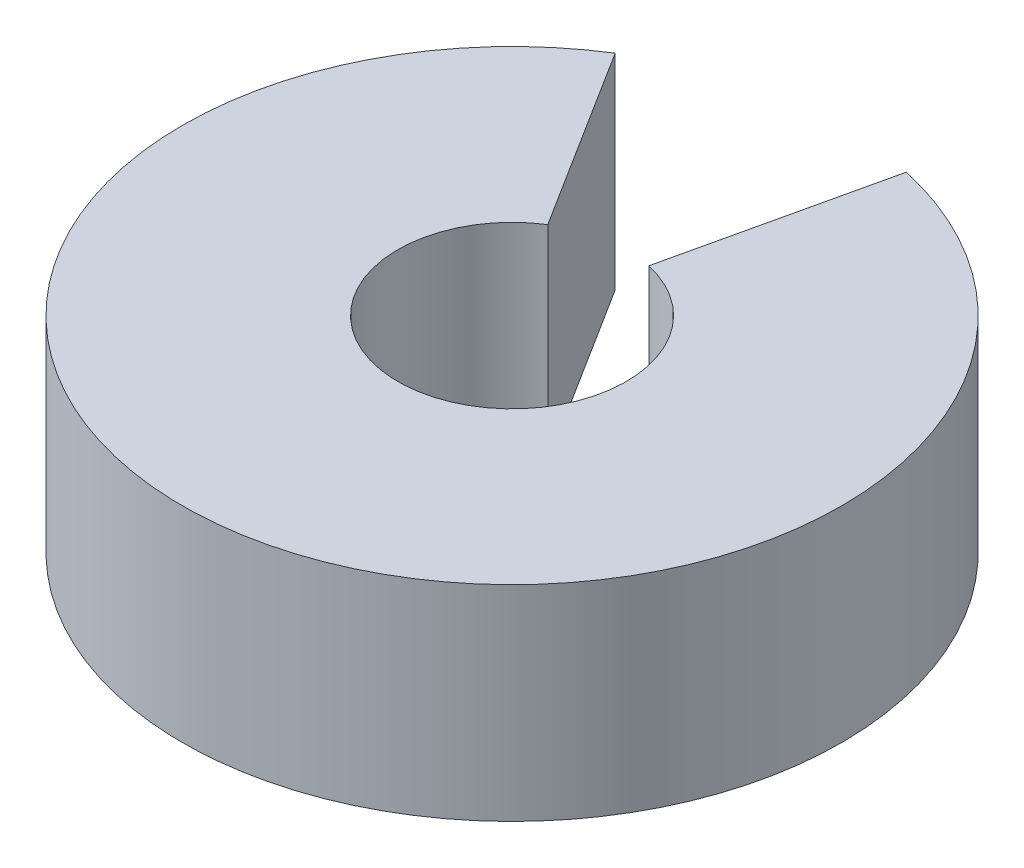
ISO-10303-21;
HEADER;
FILE_DESCRIPTION(('STEP AP214'),'2;1');
FILE_NAME('part.step','',(''),(''),'','','');
FILE_SCHEMA(('AUTOMOTIVE_DESIGN { 1 0 10303 214 1 1 1 1 }'));
ENDSEC;
DATA;
#1=APPLICATION_CONTEXT('core data for automotive mechanical design processes');
#2=APPLICATION_PROTOCOL_DEFINITION('international standard','automotive_design',2000,#1);
#3=PRODUCT_CONTEXT('',#1,'mechanical');
#4=PRODUCT('Part','Part','',(#3));
#5=PRODUCT_RELATED_PRODUCT_CATEGORY('part','',(#4));
#6=PRODUCT_DEFINITION_FORMATION('','',#4);
#7=PRODUCT_DEFINITION_CONTEXT('part definition',#1,'design');
#8=PRODUCT_DEFINITION('design','',#6,#7);
#9=PRODUCT_DEFINITION_SHAPE('','',#8);
#10=(LENGTH_UNIT() NAMED_UNIT(*) SI_UNIT(.MILLI.,.METRE.));
#11=(NAMED_UNIT(*) PLANE_ANGLE_UNIT() SI_UNIT($,.RADIAN.));
#12=(NAMED_UNIT(*) SI_UNIT($,.STERADIAN.) SOLID_ANGLE_UNIT());
#13=UNCERTAINTY_MEASURE_WITH_UNIT(LENGTH_MEASURE(1.E-05),#10,'distance_accuracy_value','');
#14=(GEOMETRIC_REPRESENTATION_CONTEXT(3) GLOBAL_UNCERTAINTY_ASSIGNED_CONTEXT((#13)) GLOBAL_UNIT_ASSIGNED_CONTEXT((#10,
#11,#12)) REPRESENTATION_CONTEXT('',''));
#15=CARTESIAN_POINT('',(0.,0.,0.));
#16=DIRECTION('',(0.,0.,1.));
#17=DIRECTION('',(1.,0.,0.));
#18=AXIS2_PLACEMENT_3D('',#15,#16,#17);
#19=CARTESIAN_POINT('',(0.,7.,0.));
#20=DIRECTION('',(0.,-1.,0.));
#21=DIRECTION('',(0.,0.,-1.));
#22=AXIS2_PLACEMENT_3D('',#19,#20,#21);
#23=CYLINDRICAL_SURFACE('',#22,11.25);
#24=DIRECTION('',(0.,1.,0.));
#25=VECTOR('',#24,1.);
#26=CARTESIAN_POINT('',(-5.99755002189294,0.,-9.51797739726734));
#27=LINE('',#26,#25);
#28=CARTESIAN_POINT('',(-5.99755002189294,0.,-9.51797739726734));
#29=VERTEX_POINT('',#28);
#30=CARTESIAN_POINT('',(-5.99755002189294,7.,-9.51797739726734));
#31=VERTEX_POINT('',#30);
#32=EDGE_CURVE('E110',#29,#31,#27,.T.);
#33=ORIENTED_EDGE('',*,*,#32,.F.);
#34=CARTESIAN_POINT('',(0.,0.,0.));
#35=DIRECTION('',(0.,1.,0.));
#36=DIRECTION('',(0.,0.,1.));
#37=AXIS2_PLACEMENT_3D('',#34,#35,#36);
#38=CIRCLE('',#37,11.25);
#39=CARTESIAN_POINT('',(2.48931806980201,0.,-10.971134651774));
#40=VERTEX_POINT('',#39);
#41=EDGE_CURVE('E48',#29,#40,#38,.T.);
#42=ORIENTED_EDGE('',*,*,#41,.T.);
#43=DIRECTION('',(0.,1.,0.));
#44=VECTOR('',#43,1.);
#45=CARTESIAN_POINT('',(2.48931806980201,0.,-10.971134651774));
#46=LINE('',#45,#44);
#47=CARTESIAN_POINT('',(2.48931806980201,7.,-10.971134651774));
#48=VERTEX_POINT('',#47);
#49=EDGE_CURVE('E115',#40,#48,#46,.T.);
#50=ORIENTED_EDGE('',*,*,#49,.T.);
#51=CARTESIAN_POINT('',(0.,7.,0.));
#52=DIRECTION('',(0.,1.,0.));
#53=DIRECTION('',(0.,0.,1.));
#54=AXIS2_PLACEMENT_3D('',#51,#52,#53);
#55=CIRCLE('',#54,11.25);
#56=EDGE_CURVE('E11',#31,#48,#55,.T.);
#57=ORIENTED_EDGE('',*,*,#56,.F.);
#58=EDGE_LOOP('',(#33,#42,#50,#57));
#59=FACE_BOUND('',#58,.T.);
#60=ADVANCED_FACE('F45',(#59),#23,.T.);
#61=CARTESIAN_POINT('',(0.,7.,0.));
#62=DIRECTION('',(0.,1.,0.));
#63=DIRECTION('',(0.,0.,1.));
#64=AXIS2_PLACEMENT_3D('',#61,#62,#63);
#65=PLANE('',#64);
#66=CARTESIAN_POINT('',(0.,7.,0.));
#67=DIRECTION('',(0.,1.,0.));
#68=DIRECTION('',(0.,0.,1.));
#69=AXIS2_PLACEMENT_3D('',#66,#67,#68);
#70=CIRCLE('',#69,3.9);
#71=CARTESIAN_POINT('',(-2.07915067425622,7.,-3.29956549771934));
#72=VERTEX_POINT('',#71);
#73=CARTESIAN_POINT('',(0.862963597531363,7.,-3.80332667928167));
#74=VERTEX_POINT('',#73);
#75=EDGE_CURVE('E106',#72,#74,#70,.T.);
#76=ORIENTED_EDGE('',*,*,#75,.F.);
#77=DIRECTION('',(-0.533115557501595,0.,-0.846042435312652));
#78=VECTOR('',#77,1.);
#79=CARTESIAN_POINT('',(0.,7.,0.));
#80=LINE('',#79,#78);
#81=EDGE_CURVE('E60',#72,#31,#80,.T.);
#82=ORIENTED_EDGE('',*,*,#81,.T.);
#83=ORIENTED_EDGE('',*,*,#56,.T.);
#84=DIRECTION('',(0.221272717315734,0.,-0.975211969046582));
#85=VECTOR('',#84,1.);
#86=CARTESIAN_POINT('',(0.,7.,0.));
#87=LINE('',#86,#85);
#88=EDGE_CURVE('E102',#74,#48,#87,.T.);
#89=ORIENTED_EDGE('',*,*,#88,.F.);
#90=EDGE_LOOP('',(#76,#82,#83,#89));
#91=FACE_BOUND('',#90,.T.);
#92=ADVANCED_FACE('F129',(#91),#65,.T.);
#93=CARTESIAN_POINT('',(0.,0.,0.));
#94=DIRECTION('',(0.,1.,0.));
#95=DIRECTION('',(0.,0.,1.));
#96=AXIS2_PLACEMENT_3D('',#93,#94,#95);
#97=PLANE('',#96);
#98=DIRECTION('',(-0.533115557501595,0.,-0.846042435312652));
#99=VECTOR('',#98,1.);
#100=CARTESIAN_POINT('',(0.,0.,0.));
#101=LINE('',#100,#99);
#102=CARTESIAN_POINT('',(-2.07915067425622,0.,-3.29956549771934));
#103=VERTEX_POINT('',#102);
#104=EDGE_CURVE('E86',#103,#29,#101,.T.);
#105=ORIENTED_EDGE('',*,*,#104,.F.);
#106=CARTESIAN_POINT('',(0.,0.,0.));
#107=DIRECTION('',(0.,1.,0.));
#108=DIRECTION('',(0.,0.,1.));
#109=AXIS2_PLACEMENT_3D('',#106,#107,#108);
#110=CIRCLE('',#109,3.9);
#111=CARTESIAN_POINT('',(0.862963597531363,0.,-3.80332667928167));
#112=VERTEX_POINT('',#111);
#113=EDGE_CURVE('E99',#103,#112,#110,.T.);
#114=ORIENTED_EDGE('',*,*,#113,.T.);
#115=DIRECTION('',(0.221272717315734,0.,-0.975211969046582));
#116=VECTOR('',#115,1.);
#117=CARTESIAN_POINT('',(0.,0.,0.));
#118=LINE('',#117,#116);
#119=EDGE_CURVE('E68',#112,#40,#118,.T.);
#120=ORIENTED_EDGE('',*,*,#119,.T.);
#121=ORIENTED_EDGE('',*,*,#41,.F.);
#122=EDGE_LOOP('',(#105,#114,#120,#121));
#123=FACE_BOUND('',#122,.T.);
#124=ADVANCED_FACE('F98',(#123),#97,.F.);
#125=CARTESIAN_POINT('',(0.,0.,0.));
#126=DIRECTION('',(0.,1.,0.));
#127=DIRECTION('',(0.,0.,1.));
#128=AXIS2_PLACEMENT_3D('',#125,#126,#127);
#129=CYLINDRICAL_SURFACE('',#128,3.9);
#130=DIRECTION('',(0.,1.,0.));
#131=VECTOR('',#130,1.);
#132=CARTESIAN_POINT('',(-2.07915067425622,0.,-3.29956549771934));
#133=LINE('',#132,#131);
#134=EDGE_CURVE('E83',#103,#72,#133,.T.);
#135=ORIENTED_EDGE('',*,*,#134,.T.);
#136=ORIENTED_EDGE('',*,*,#75,.T.);
#137=DIRECTION('',(0.,1.,0.));
#138=VECTOR('',#137,1.);
#139=CARTESIAN_POINT('',(0.862963597531363,0.,-3.80332667928167));
#140=LINE('',#139,#138);
#141=EDGE_CURVE('E93',#112,#74,#140,.T.);
#142=ORIENTED_EDGE('',*,*,#141,.F.);
#143=ORIENTED_EDGE('',*,*,#113,.F.);
#144=EDGE_LOOP('',(#135,#136,#142,#143));
#145=FACE_BOUND('',#144,.T.);
#146=ADVANCED_FACE('F104',(#145),#129,.F.);
#147=CARTESIAN_POINT('',(0.,0.,0.));
#148=DIRECTION('',(0.975211969046582,0.,0.221272717315734));
#149=DIRECTION('',(0.221272717315734,0.,-0.975211969046582));
#150=AXIS2_PLACEMENT_3D('',#147,#148,#149);
#151=PLANE('',#150);
#152=ORIENTED_EDGE('',*,*,#88,.T.);
#153=ORIENTED_EDGE('',*,*,#49,.F.);
#154=ORIENTED_EDGE('',*,*,#119,.F.);
#155=ORIENTED_EDGE('',*,*,#141,.T.);
#156=EDGE_LOOP('',(#152,#153,#154,#155));
#157=FACE_BOUND('',#156,.T.);
#158=ADVANCED_FACE('F131',(#157),#151,.F.);
#159=CARTESIAN_POINT('',(0.,0.,0.));
#160=DIRECTION('',(0.846042435312652,0.,-0.533115557501595));
#161=DIRECTION('',(-0.533115557501595,0.,-0.846042435312652));
#162=AXIS2_PLACEMENT_3D('',#159,#160,#161);
#163=PLANE('',#162);
#164=ORIENTED_EDGE('',*,*,#81,.F.);
#165=ORIENTED_EDGE('',*,*,#134,.F.);
#166=ORIENTED_EDGE('',*,*,#104,.T.);
#167=ORIENTED_EDGE('',*,*,#32,.T.);
#168=EDGE_LOOP('',(#164,#165,#166,#167));
#169=FACE_BOUND('',#168,.T.);
#170=ADVANCED_FACE('F85',(#169),#163,.T.);
#171=CLOSED_SHELL('',(#60,#92,#124,#146,#158,#170));
#172=MANIFOLD_SOLID_BREP('B2',#171);
#173=ADVANCED_BREP_SHAPE_REPRESENTATION('',(#18,#172),#14);
#174=SHAPE_DEFINITION_REPRESENTATION(#9,#173);
ENDSEC;
END-ISO-10303-21;
